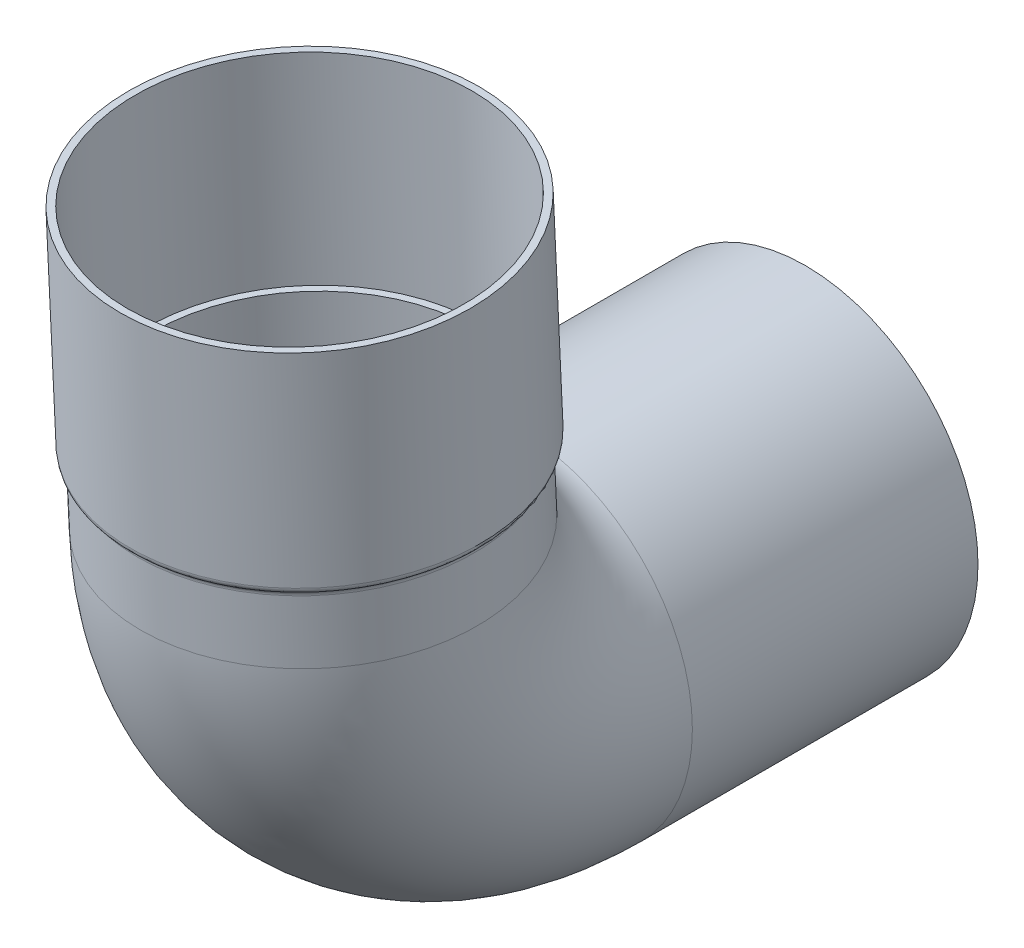
ISO-10303-21;
HEADER;
FILE_DESCRIPTION(('STEP AP214'),'2;1');
FILE_NAME('part.step','',(''),(''),'','','');
FILE_SCHEMA(('AUTOMOTIVE_DESIGN { 1 0 10303 214 1 1 1 1 }'));
ENDSEC;
DATA;
#1=APPLICATION_CONTEXT('core data for automotive mechanical design processes');
#2=APPLICATION_PROTOCOL_DEFINITION('international standard','automotive_design',2000,#1);
#3=PRODUCT_CONTEXT('',#1,'mechanical');
#4=PRODUCT('Part','Part','',(#3));
#5=PRODUCT_RELATED_PRODUCT_CATEGORY('part','',(#4));
#6=PRODUCT_DEFINITION_FORMATION('','',#4);
#7=PRODUCT_DEFINITION_CONTEXT('part definition',#1,'design');
#8=PRODUCT_DEFINITION('design','',#6,#7);
#9=PRODUCT_DEFINITION_SHAPE('','',#8);
#10=(LENGTH_UNIT() NAMED_UNIT(*) SI_UNIT(.MILLI.,.METRE.));
#11=(NAMED_UNIT(*) PLANE_ANGLE_UNIT() SI_UNIT($,.RADIAN.));
#12=(NAMED_UNIT(*) SI_UNIT($,.STERADIAN.) SOLID_ANGLE_UNIT());
#13=UNCERTAINTY_MEASURE_WITH_UNIT(LENGTH_MEASURE(1.E-05),#10,'distance_accuracy_value','');
#14=(GEOMETRIC_REPRESENTATION_CONTEXT(3) GLOBAL_UNCERTAINTY_ASSIGNED_CONTEXT((#13)) GLOBAL_UNIT_ASSIGNED_CONTEXT((#10,
#11,#12)) REPRESENTATION_CONTEXT('',''));
#15=CARTESIAN_POINT('',(0.,0.,0.));
#16=DIRECTION('',(0.,0.,1.));
#17=DIRECTION('',(1.,0.,0.));
#18=AXIS2_PLACEMENT_3D('',#15,#16,#17);
#19=CARTESIAN_POINT('',(0.,28.5868064787108,71.3481195716261));
#20=DIRECTION('',(0.,0.99888987496197,0.0471064507096383));
#21=DIRECTION('',(0.,-0.0471064507096383,0.99888987496197));
#22=AXIS2_PLACEMENT_3D('',#19,#20,#21);
#23=CYLINDRICAL_SURFACE('',#22,25.);
#24=CARTESIAN_POINT('',(0.,37.9578152485549,71.7900451269663));
#25=DIRECTION('',(0.,0.99888987496197,0.0471064507096399));
#26=DIRECTION('',(0.,-0.0471064507096399,0.99888987496197));
#27=AXIS2_PLACEMENT_3D('',#24,#25,#26);
#28=CIRCLE('',#27,25.);
#29=CARTESIAN_POINT('',(0.,36.7801539808139,96.7622920010156));
#30=VERTEX_POINT('',#29);
#31=EDGE_CURVE('E54',#30,#30,#28,.F.);
#32=ORIENTED_EDGE('',*,*,#31,.T.);
#33=EDGE_LOOP('',(#32));
#34=FACE_BOUND('',#33,.T.);
#35=CARTESIAN_POINT('',(0.,28.5868064787108,71.3481195716261));
#36=DIRECTION('',(0.,0.99888987496197,0.0471064507096398));
#37=DIRECTION('',(1.,0.,0.));
#38=AXIS2_PLACEMENT_3D('',#35,#36,#37);
#39=CIRCLE('',#38,25.);
#40=CARTESIAN_POINT('',(0.,27.4091452109698,96.3203664456754));
#41=VERTEX_POINT('',#40);
#42=EDGE_CURVE('E63',#41,#41,#39,.T.);
#43=ORIENTED_EDGE('',*,*,#42,.T.);
#44=EDGE_LOOP('',(#43));
#45=FACE_BOUND('',#44,.T.);
#46=ADVANCED_FACE('F43',(#34,#45),#23,.T.);
#47=CARTESIAN_POINT('',(0.,30.,41.381423322767));
#48=DIRECTION('',(-1.,0.,0.));
#49=DIRECTION('',(0.,0.,1.));
#50=AXIS2_PLACEMENT_3D('',#47,#48,#49);
#51=TOROIDAL_SURFACE('',#50,30.,25.);
#52=CARTESIAN_POINT('',(0.,0.,41.381423322767));
#53=DIRECTION('',(0.,0.,1.));
#54=DIRECTION('',(1.,0.,0.));
#55=AXIS2_PLACEMENT_3D('',#52,#53,#54);
#56=CIRCLE('',#55,25.);
#57=CARTESIAN_POINT('',(0.,-25.,41.381423322767));
#58=VERTEX_POINT('',#57);
#59=EDGE_CURVE('E66',#58,#58,#56,.T.);
#60=CARTESIAN_POINT('',(0.,30.,41.381423322767));
#61=DIRECTION('',(-1.,0.,0.));
#62=DIRECTION('',(0.,0.,1.));
#63=AXIS2_PLACEMENT_3D('',#60,#61,#62);
#64=CIRCLE('',#63,55.);
#65=EDGE_CURVE('',#58,#41,#64,.T.);
#66=ORIENTED_EDGE('',*,*,#59,.T.);
#67=ORIENTED_EDGE('',*,*,#42,.F.);
#68=ORIENTED_EDGE('',*,*,#65,.T.);
#69=ORIENTED_EDGE('',*,*,#65,.F.);
#70=EDGE_LOOP('',(#66,#68,#67,#69));
#71=FACE_BOUND('',#70,.T.);
#72=ADVANCED_FACE('F109',(#71),#51,.T.);
#73=CARTESIAN_POINT('',(0.,0.,41.381423322767));
#74=DIRECTION('',(0.,0.,-1.));
#75=DIRECTION('',(0.,1.,0.));
#76=AXIS2_PLACEMENT_3D('',#73,#74,#75);
#77=CYLINDRICAL_SURFACE('',#76,25.);
#78=ORIENTED_EDGE('',*,*,#59,.F.);
#79=EDGE_LOOP('',(#78));
#80=FACE_BOUND('',#79,.T.);
#81=CARTESIAN_POINT('',(0.,0.,0.));
#82=DIRECTION('',(0.,0.,1.));
#83=DIRECTION('',(1.,0.,0.));
#84=AXIS2_PLACEMENT_3D('',#81,#82,#83);
#85=CIRCLE('',#84,25.);
#86=CARTESIAN_POINT('',(25.,0.,0.));
#87=VERTEX_POINT('',#86);
#88=EDGE_CURVE('E67',#87,#87,#85,.T.);
#89=ORIENTED_EDGE('',*,*,#88,.T.);
#90=EDGE_LOOP('',(#89));
#91=FACE_BOUND('',#90,.T.);
#92=ADVANCED_FACE('F115',(#80,#91),#77,.T.);
#93=CARTESIAN_POINT('',(0.,0.,0.));
#94=DIRECTION('',(0.,0.,1.));
#95=DIRECTION('',(1.,0.,0.));
#96=AXIS2_PLACEMENT_3D('',#93,#94,#95);
#97=PLANE('',#96);
#98=CARTESIAN_POINT('',(0.,0.,0.));
#99=DIRECTION('',(0.,0.,1.));
#100=DIRECTION('',(1.,0.,0.));
#101=AXIS2_PLACEMENT_3D('',#98,#99,#100);
#102=CIRCLE('',#101,24.);
#103=CARTESIAN_POINT('',(24.,0.,0.));
#104=VERTEX_POINT('',#103);
#105=EDGE_CURVE('E73',#104,#104,#102,.T.);
#106=ORIENTED_EDGE('',*,*,#105,.T.);
#107=EDGE_LOOP('',(#106));
#108=FACE_BOUND('',#107,.T.);
#109=ORIENTED_EDGE('',*,*,#88,.F.);
#110=EDGE_LOOP('',(#109));
#111=FACE_BOUND('',#110,.T.);
#112=ADVANCED_FACE('F178',(#108,#111),#97,.F.);
#113=CARTESIAN_POINT('',(0.,28.5868064787108,71.3481195716261));
#114=DIRECTION('',(0.,0.99888987496197,0.0471064507096383));
#115=DIRECTION('',(0.,-0.0471064507096383,0.99888987496197));
#116=AXIS2_PLACEMENT_3D('',#113,#114,#115);
#117=CYLINDRICAL_SURFACE('',#116,24.);
#118=CARTESIAN_POINT('',(0.,28.5868064787108,71.3481195716261));
#119=DIRECTION('',(0.,0.99888987496197,0.0471064507096383));
#120=DIRECTION('',(0.,-0.0471064507096383,0.99888987496197));
#121=AXIS2_PLACEMENT_3D('',#118,#119,#120);
#122=CIRCLE('',#121,24.);
#123=CARTESIAN_POINT('',(0.,27.4562516616794,95.3214765707134));
#124=VERTEX_POINT('',#123);
#125=EDGE_CURVE('E70',#124,#124,#122,.T.);
#126=ORIENTED_EDGE('',*,*,#125,.F.);
#127=EDGE_LOOP('',(#126));
#128=FACE_BOUND('',#127,.T.);
#129=CARTESIAN_POINT('',(0.,39.9555949984788,71.8842580283856));
#130=DIRECTION('',(0.,0.99888987496197,0.0471064507096399));
#131=DIRECTION('',(0.,-0.0471064507096399,0.99888987496197));
#132=AXIS2_PLACEMENT_3D('',#129,#130,#131);
#133=CIRCLE('',#132,24.);
#134=CARTESIAN_POINT('',(0.,38.8250401814474,95.8576150274729));
#135=VERTEX_POINT('',#134);
#136=EDGE_CURVE('E77',#135,#135,#133,.T.);
#137=ORIENTED_EDGE('',*,*,#136,.T.);
#138=EDGE_LOOP('',(#137));
#139=FACE_BOUND('',#138,.T.);
#140=ADVANCED_FACE('F173',(#128,#139),#117,.F.);
#141=CARTESIAN_POINT('',(0.,30.,41.381423322767));
#142=DIRECTION('',(-1.,0.,0.));
#143=DIRECTION('',(0.,0.,1.));
#144=AXIS2_PLACEMENT_3D('',#141,#142,#143);
#145=TOROIDAL_SURFACE('',#144,30.,24.);
#146=CARTESIAN_POINT('',(0.,0.,41.381423322767));
#147=DIRECTION('',(0.,0.,-1.));
#148=DIRECTION('',(0.,1.,0.));
#149=AXIS2_PLACEMENT_3D('',#146,#147,#148);
#150=CIRCLE('',#149,24.);
#151=CARTESIAN_POINT('',(0.,-24.,41.381423322767));
#152=VERTEX_POINT('',#151);
#153=EDGE_CURVE('E76',#152,#152,#150,.F.);
#154=CARTESIAN_POINT('',(0.,30.,41.381423322767));
#155=DIRECTION('',(-1.,0.,0.));
#156=DIRECTION('',(0.,0.,1.));
#157=AXIS2_PLACEMENT_3D('',#154,#155,#156);
#158=CIRCLE('',#157,54.);
#159=EDGE_CURVE('',#152,#124,#158,.T.);
#160=ORIENTED_EDGE('',*,*,#153,.F.);
#161=ORIENTED_EDGE('',*,*,#125,.T.);
#162=ORIENTED_EDGE('',*,*,#159,.T.);
#163=ORIENTED_EDGE('',*,*,#159,.F.);
#164=EDGE_LOOP('',(#160,#162,#161,#163));
#165=FACE_BOUND('',#164,.T.);
#166=ADVANCED_FACE('F177',(#165),#145,.F.);
#167=CARTESIAN_POINT('',(0.,0.,41.381423322767));
#168=DIRECTION('',(0.,0.,-1.));
#169=DIRECTION('',(0.,1.,0.));
#170=AXIS2_PLACEMENT_3D('',#167,#168,#169);
#171=CYLINDRICAL_SURFACE('',#170,24.);
#172=ORIENTED_EDGE('',*,*,#153,.T.);
#173=EDGE_LOOP('',(#172));
#174=FACE_BOUND('',#173,.T.);
#175=ORIENTED_EDGE('',*,*,#105,.F.);
#176=EDGE_LOOP('',(#175));
#177=FACE_BOUND('',#176,.T.);
#178=ADVANCED_FACE('F166',(#174,#177),#171,.F.);
#179=CARTESIAN_POINT('',(0.,39.9555949984788,71.8842580283856));
#180=DIRECTION('',(0.,0.99888987496197,0.0471064507096399));
#181=DIRECTION('',(0.,-0.0471064507096399,0.99888987496197));
#182=AXIS2_PLACEMENT_3D('',#179,#180,#181);
#183=PLANE('',#182);
#184=CARTESIAN_POINT('',(0.,39.9555949984788,71.8842580283856));
#185=DIRECTION('',(0.,0.99888987496197,0.0471064507096399));
#186=DIRECTION('',(0.,-0.0471064507096399,0.99888987496197));
#187=AXIS2_PLACEMENT_3D('',#184,#185,#186);
#188=CIRCLE('',#187,25.);
#189=CARTESIAN_POINT('',(0.,38.7779337307378,96.8565049024348));
#190=VERTEX_POINT('',#189);
#191=EDGE_CURVE('E58',#190,#190,#188,.F.);
#192=ORIENTED_EDGE('',*,*,#191,.F.);
#193=EDGE_LOOP('',(#192));
#194=FACE_BOUND('',#193,.T.);
#195=ORIENTED_EDGE('',*,*,#136,.F.);
#196=EDGE_LOOP('',(#195));
#197=FACE_BOUND('',#196,.T.);
#198=ADVANCED_FACE('F105',(#194,#197),#183,.T.);
#199=CARTESIAN_POINT('',(0.,39.9555949984788,71.8842580283856));
#200=DIRECTION('',(0.,-0.99888987496197,-0.0471064507096399));
#201=DIRECTION('',(0.,0.0471064507096399,-0.99888987496197));
#202=AXIS2_PLACEMENT_3D('',#199,#200,#201);
#203=CYLINDRICAL_SURFACE('',#202,26.);
#204=CARTESIAN_POINT('',(0.,39.6879432631556,71.8716358929597));
#205=DIRECTION('',(0.,-0.99888987496197,-0.0471064507096399));
#206=DIRECTION('',(0.,0.0471064507096399,-0.99888987496197));
#207=AXIS2_PLACEMENT_3D('',#204,#205,#206);
#208=CIRCLE('',#207,26.);
#209=CARTESIAN_POINT('',(0.,40.9127109816062,45.9004991439484));
#210=VERTEX_POINT('',#209);
#211=EDGE_CURVE('E50',#210,#210,#208,.F.);
#212=ORIENTED_EDGE('',*,*,#211,.T.);
#213=EDGE_LOOP('',(#212));
#214=FACE_BOUND('',#213,.T.);
#215=CARTESIAN_POINT('',(0.,69.9222912473379,73.2974515496748));
#216=DIRECTION('',(0.,0.99888987496197,0.0471064507096399));
#217=DIRECTION('',(0.,-0.0471064507096399,0.99888987496197));
#218=AXIS2_PLACEMENT_3D('',#215,#216,#217);
#219=CIRCLE('',#218,26.);
#220=CARTESIAN_POINT('',(0.,68.6975235288873,99.268588298686));
#221=VERTEX_POINT('',#220);
#222=EDGE_CURVE('E84',#221,#221,#219,.T.);
#223=ORIENTED_EDGE('',*,*,#222,.F.);
#224=EDGE_LOOP('',(#223));
#225=FACE_BOUND('',#224,.T.);
#226=ADVANCED_FACE('F96',(#214,#225),#203,.T.);
#227=CARTESIAN_POINT('',(0.,69.9222912473379,73.2974515496748));
#228=DIRECTION('',(0.,0.99888987496197,0.0471064507096399));
#229=DIRECTION('',(0.,-0.0471064507096399,0.99888987496197));
#230=AXIS2_PLACEMENT_3D('',#227,#228,#229);
#231=PLANE('',#230);
#232=ORIENTED_EDGE('',*,*,#222,.T.);
#233=EDGE_LOOP('',(#232));
#234=FACE_BOUND('',#233,.T.);
#235=CARTESIAN_POINT('',(0.,69.9222912473379,73.2974515496748));
#236=DIRECTION('',(0.,0.99888987496197,0.0471064507096399));
#237=DIRECTION('',(1.,0.,0.));
#238=AXIS2_PLACEMENT_3D('',#235,#236,#237);
#239=CIRCLE('',#238,25.);
#240=CARTESIAN_POINT('',(25.,69.9222912473379,73.2974515496748));
#241=VERTEX_POINT('',#240);
#242=EDGE_CURVE('E87',#241,#241,#239,.T.);
#243=ORIENTED_EDGE('',*,*,#242,.F.);
#244=EDGE_LOOP('',(#243));
#245=FACE_BOUND('',#244,.T.);
#246=ADVANCED_FACE('F94',(#234,#245),#231,.T.);
#247=CARTESIAN_POINT('',(0.,69.9222912473379,73.2974515496748));
#248=DIRECTION('',(0.,-0.99888987496197,-0.0471064507096399));
#249=DIRECTION('',(0.,0.0471064507096399,-0.99888987496197));
#250=AXIS2_PLACEMENT_3D('',#247,#248,#249);
#251=CYLINDRICAL_SURFACE('',#250,25.);
#252=ORIENTED_EDGE('',*,*,#242,.T.);
#253=EDGE_LOOP('',(#252));
#254=FACE_BOUND('',#253,.T.);
#255=ORIENTED_EDGE('',*,*,#191,.T.);
#256=EDGE_LOOP('',(#255));
#257=FACE_BOUND('',#256,.T.);
#258=ADVANCED_FACE('F91',(#254,#257),#251,.F.);
#259=CARTESIAN_POINT('',(0.,37.9578152485549,71.7900451269663));
#260=DIRECTION('',(0.,0.99888987496197,0.0471064507096399));
#261=DIRECTION('',(0.,-0.0471064507096399,0.99888987496197));
#262=AXIS2_PLACEMENT_3D('',#259,#260,#261);
#263=TOROIDAL_SURFACE('',#262,26.,1.);
#264=CARTESIAN_POINT('',(0.,38.822879255855,71.830840509963));
#265=DIRECTION('',(0.,-0.99888987496197,-0.0471064507096399));
#266=DIRECTION('',(0.,0.0471064507096399,-0.99888987496197));
#267=AXIS2_PLACEMENT_3D('',#264,#265,#266);
#268=CIRCLE('',#267,25.5000000000002);
#269=CARTESIAN_POINT('',(0.,40.0240937489509,46.3591486984325));
#270=VERTEX_POINT('',#269);
#271=EDGE_CURVE('E11',#270,#270,#268,.T.);
#272=ORIENTED_EDGE('',*,*,#271,.T.);
#273=EDGE_LOOP('',(#272));
#274=FACE_BOUND('',#273,.T.);
#275=ORIENTED_EDGE('',*,*,#31,.F.);
#276=EDGE_LOOP('',(#275));
#277=FACE_BOUND('',#276,.T.);
#278=ADVANCED_FACE('F103',(#274,#277),#263,.F.);
#279=CARTESIAN_POINT('',(0.,39.6879432631556,71.8716358929597));
#280=DIRECTION('',(0.,-0.99888987496197,-0.0471064507096399));
#281=DIRECTION('',(0.,0.0471064507096399,-0.99888987496197));
#282=AXIS2_PLACEMENT_3D('',#279,#280,#281);
#283=TOROIDAL_SURFACE('',#282,25.0000000000002,1.);
#284=ORIENTED_EDGE('',*,*,#271,.F.);
#285=EDGE_LOOP('',(#284));
#286=FACE_BOUND('',#285,.T.);
#287=ORIENTED_EDGE('',*,*,#211,.F.);
#288=EDGE_LOOP('',(#287));
#289=FACE_BOUND('',#288,.T.);
#290=ADVANCED_FACE('F45',(#286,#289),#283,.T.);
#291=CLOSED_SHELL('',(#46,#72,#92,#112,#140,#166,#178,#198,#226,#246,#258,#278,#290));
#292=MANIFOLD_SOLID_BREP('B2',#291);
#293=ADVANCED_BREP_SHAPE_REPRESENTATION('',(#18,#292),#14);
#294=SHAPE_DEFINITION_REPRESENTATION(#9,#293);
ENDSEC;
END-ISO-10303-21;
